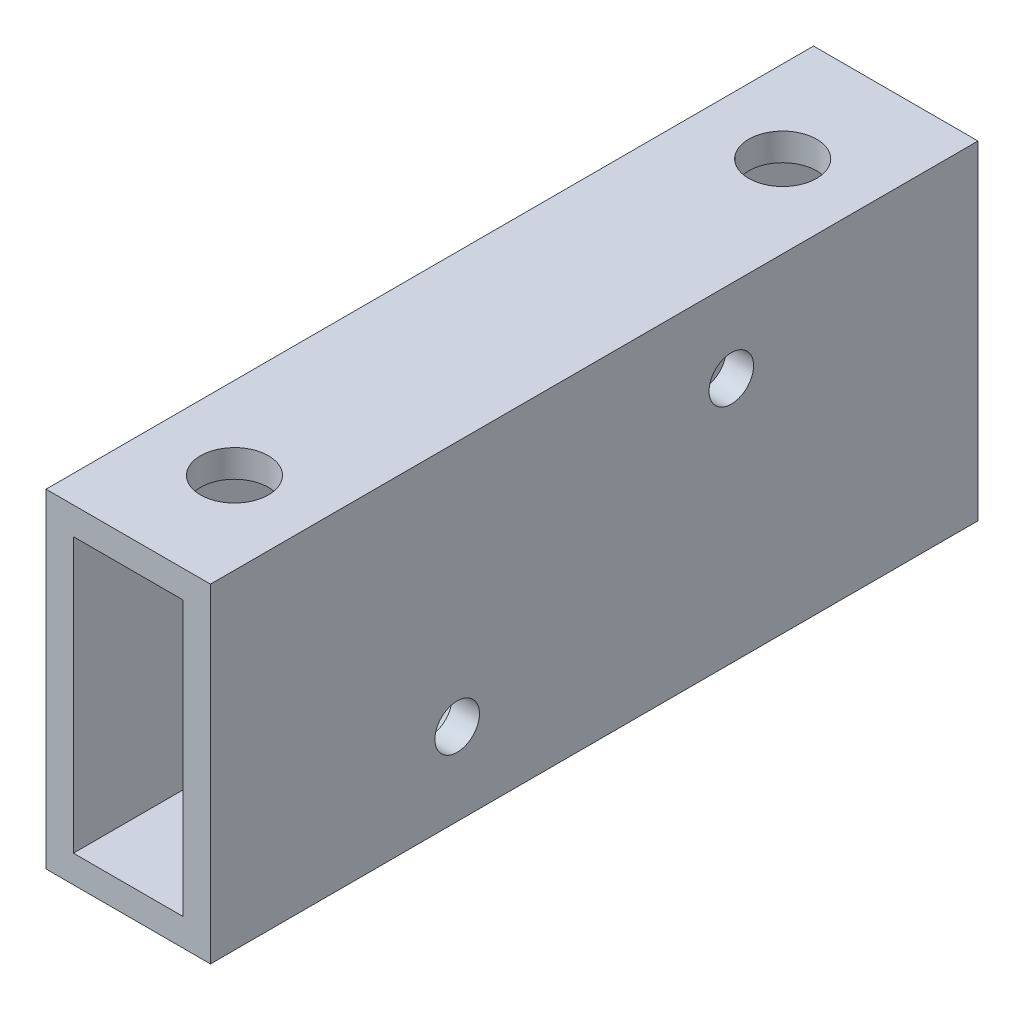
ISO-10303-21;
HEADER;
FILE_DESCRIPTION(('STEP AP214'),'2;1');
FILE_NAME('part.step','',(''),(''),'','','');
FILE_SCHEMA(('AUTOMOTIVE_DESIGN { 1 0 10303 214 1 1 1 1 }'));
ENDSEC;
DATA;
#1=APPLICATION_CONTEXT('core data for automotive mechanical design processes');
#2=APPLICATION_PROTOCOL_DEFINITION('international standard','automotive_design',2000,#1);
#3=PRODUCT_CONTEXT('',#1,'mechanical');
#4=PRODUCT('Part','Part','',(#3));
#5=PRODUCT_RELATED_PRODUCT_CATEGORY('part','',(#4));
#6=PRODUCT_DEFINITION_FORMATION('','',#4);
#7=PRODUCT_DEFINITION_CONTEXT('part definition',#1,'design');
#8=PRODUCT_DEFINITION('design','',#6,#7);
#9=PRODUCT_DEFINITION_SHAPE('','',#8);
#10=(LENGTH_UNIT() NAMED_UNIT(*) SI_UNIT(.MILLI.,.METRE.));
#11=(NAMED_UNIT(*) PLANE_ANGLE_UNIT() SI_UNIT($,.RADIAN.));
#12=(NAMED_UNIT(*) SI_UNIT($,.STERADIAN.) SOLID_ANGLE_UNIT());
#13=UNCERTAINTY_MEASURE_WITH_UNIT(LENGTH_MEASURE(1.E-05),#10,'distance_accuracy_value','');
#14=(GEOMETRIC_REPRESENTATION_CONTEXT(3) GLOBAL_UNCERTAINTY_ASSIGNED_CONTEXT((#13)) GLOBAL_UNIT_ASSIGNED_CONTEXT((#10,
#11,#12)) REPRESENTATION_CONTEXT('',''));
#15=CARTESIAN_POINT('',(0.,0.,0.));
#16=DIRECTION('',(0.,0.,1.));
#17=DIRECTION('',(1.,0.,0.));
#18=AXIS2_PLACEMENT_3D('',#15,#16,#17);
#19=CARTESIAN_POINT('',(0.,0.,88.9));
#20=DIRECTION('',(0.,0.,-1.));
#21=DIRECTION('',(-1.,0.,0.));
#22=AXIS2_PLACEMENT_3D('',#19,#20,#21);
#23=PLANE('',#22);
#24=DIRECTION('',(0.,1.,0.));
#25=VECTOR('',#24,1.);
#26=CARTESIAN_POINT('',(9.525,-19.05,88.9));
#27=LINE('',#26,#25);
#28=CARTESIAN_POINT('',(9.525,-19.05,88.9));
#29=VERTEX_POINT('',#28);
#30=CARTESIAN_POINT('',(9.525,19.05,88.9));
#31=VERTEX_POINT('',#30);
#32=EDGE_CURVE('E135',#29,#31,#27,.T.);
#33=ORIENTED_EDGE('',*,*,#32,.T.);
#34=DIRECTION('',(-1.,0.,0.));
#35=VECTOR('',#34,1.);
#36=CARTESIAN_POINT('',(-9.525,19.05,88.9));
#37=LINE('',#36,#35);
#38=CARTESIAN_POINT('',(-9.525,19.05,88.9));
#39=VERTEX_POINT('',#38);
#40=EDGE_CURVE('E138',#31,#39,#37,.T.);
#41=ORIENTED_EDGE('',*,*,#40,.T.);
#42=DIRECTION('',(0.,-1.,0.));
#43=VECTOR('',#42,1.);
#44=CARTESIAN_POINT('',(-9.525,-19.05,88.9));
#45=LINE('',#44,#43);
#46=CARTESIAN_POINT('',(-9.525,-19.05,88.9));
#47=VERTEX_POINT('',#46);
#48=EDGE_CURVE('E141',#39,#47,#45,.T.);
#49=ORIENTED_EDGE('',*,*,#48,.T.);
#50=DIRECTION('',(1.,0.,0.));
#51=VECTOR('',#50,1.);
#52=CARTESIAN_POINT('',(-9.525,-19.05,88.9));
#53=LINE('',#52,#51);
#54=EDGE_CURVE('E143',#47,#29,#53,.T.);
#55=ORIENTED_EDGE('',*,*,#54,.T.);
#56=EDGE_LOOP('',(#33,#41,#49,#55));
#57=FACE_BOUND('',#56,.T.);
#58=DIRECTION('',(1.,0.,0.));
#59=VECTOR('',#58,1.);
#60=CARTESIAN_POINT('',(-6.35,-15.875,88.9));
#61=LINE('',#60,#59);
#62=CARTESIAN_POINT('',(-6.35,-15.875,88.9));
#63=VERTEX_POINT('',#62);
#64=CARTESIAN_POINT('',(6.35,-15.875,88.9));
#65=VERTEX_POINT('',#64);
#66=EDGE_CURVE('E97',#63,#65,#61,.T.);
#67=ORIENTED_EDGE('',*,*,#66,.F.);
#68=DIRECTION('',(0.,-1.,0.));
#69=VECTOR('',#68,1.);
#70=CARTESIAN_POINT('',(-6.35,-15.875,88.9));
#71=LINE('',#70,#69);
#72=CARTESIAN_POINT('',(-6.35,15.875,88.9));
#73=VERTEX_POINT('',#72);
#74=EDGE_CURVE('E119',#73,#63,#71,.T.);
#75=ORIENTED_EDGE('',*,*,#74,.F.);
#76=DIRECTION('',(-1.,0.,0.));
#77=VECTOR('',#76,1.);
#78=CARTESIAN_POINT('',(-6.35,15.875,88.9));
#79=LINE('',#78,#77);
#80=CARTESIAN_POINT('',(6.35,15.875,88.9));
#81=VERTEX_POINT('',#80);
#82=EDGE_CURVE('E117',#81,#73,#79,.T.);
#83=ORIENTED_EDGE('',*,*,#82,.F.);
#84=DIRECTION('',(0.,1.,0.));
#85=VECTOR('',#84,1.);
#86=CARTESIAN_POINT('',(6.35,-15.875,88.9));
#87=LINE('',#86,#85);
#88=EDGE_CURVE('E105',#65,#81,#87,.T.);
#89=ORIENTED_EDGE('',*,*,#88,.F.);
#90=EDGE_LOOP('',(#67,#75,#83,#89));
#91=FACE_BOUND('',#90,.T.);
#92=ADVANCED_FACE('F32',(#57,#91),#23,.F.);
#93=CARTESIAN_POINT('',(0.,0.,0.));
#94=DIRECTION('',(0.,0.,-1.));
#95=DIRECTION('',(-1.,0.,0.));
#96=AXIS2_PLACEMENT_3D('',#93,#94,#95);
#97=PLANE('',#96);
#98=DIRECTION('',(0.,1.,0.));
#99=VECTOR('',#98,1.);
#100=CARTESIAN_POINT('',(9.525,-19.05,0.));
#101=LINE('',#100,#99);
#102=CARTESIAN_POINT('',(9.525,-19.05,0.));
#103=VERTEX_POINT('',#102);
#104=CARTESIAN_POINT('',(9.525,19.05,0.));
#105=VERTEX_POINT('',#104);
#106=EDGE_CURVE('E113',#103,#105,#101,.T.);
#107=ORIENTED_EDGE('',*,*,#106,.F.);
#108=DIRECTION('',(1.,0.,0.));
#109=VECTOR('',#108,1.);
#110=CARTESIAN_POINT('',(-9.525,-19.05,0.));
#111=LINE('',#110,#109);
#112=CARTESIAN_POINT('',(-9.525,-19.05,0.));
#113=VERTEX_POINT('',#112);
#114=EDGE_CURVE('E139',#113,#103,#111,.T.);
#115=ORIENTED_EDGE('',*,*,#114,.F.);
#116=DIRECTION('',(0.,-1.,0.));
#117=VECTOR('',#116,1.);
#118=CARTESIAN_POINT('',(-9.525,-19.05,0.));
#119=LINE('',#118,#117);
#120=CARTESIAN_POINT('',(-9.525,19.05,0.));
#121=VERTEX_POINT('',#120);
#122=EDGE_CURVE('E150',#121,#113,#119,.T.);
#123=ORIENTED_EDGE('',*,*,#122,.F.);
#124=DIRECTION('',(-1.,0.,0.));
#125=VECTOR('',#124,1.);
#126=CARTESIAN_POINT('',(-9.525,19.05,0.));
#127=LINE('',#126,#125);
#128=EDGE_CURVE('E148',#105,#121,#127,.T.);
#129=ORIENTED_EDGE('',*,*,#128,.F.);
#130=EDGE_LOOP('',(#107,#115,#123,#129));
#131=FACE_BOUND('',#130,.T.);
#132=DIRECTION('',(0.,-1.,0.));
#133=VECTOR('',#132,1.);
#134=CARTESIAN_POINT('',(-6.35,-15.875,0.));
#135=LINE('',#134,#133);
#136=CARTESIAN_POINT('',(-6.35,15.875,0.));
#137=VERTEX_POINT('',#136);
#138=CARTESIAN_POINT('',(-6.35,-15.875,0.));
#139=VERTEX_POINT('',#138);
#140=EDGE_CURVE('E106',#137,#139,#135,.T.);
#141=ORIENTED_EDGE('',*,*,#140,.T.);
#142=DIRECTION('',(1.,0.,0.));
#143=VECTOR('',#142,1.);
#144=CARTESIAN_POINT('',(-6.35,-15.875,0.));
#145=LINE('',#144,#143);
#146=CARTESIAN_POINT('',(6.35,-15.875,0.));
#147=VERTEX_POINT('',#146);
#148=EDGE_CURVE('E55',#139,#147,#145,.T.);
#149=ORIENTED_EDGE('',*,*,#148,.T.);
#150=DIRECTION('',(0.,1.,0.));
#151=VECTOR('',#150,1.);
#152=CARTESIAN_POINT('',(6.35,-15.875,0.));
#153=LINE('',#152,#151);
#154=CARTESIAN_POINT('',(6.35,15.875,0.));
#155=VERTEX_POINT('',#154);
#156=EDGE_CURVE('E112',#147,#155,#153,.T.);
#157=ORIENTED_EDGE('',*,*,#156,.T.);
#158=DIRECTION('',(-1.,0.,0.));
#159=VECTOR('',#158,1.);
#160=CARTESIAN_POINT('',(-6.35,15.875,0.));
#161=LINE('',#160,#159);
#162=EDGE_CURVE('E127',#155,#137,#161,.T.);
#163=ORIENTED_EDGE('',*,*,#162,.T.);
#164=EDGE_LOOP('',(#141,#149,#157,#163));
#165=FACE_BOUND('',#164,.T.);
#166=ADVANCED_FACE('F168',(#131,#165),#97,.T.);
#167=CARTESIAN_POINT('',(9.525,-19.05,88.9));
#168=DIRECTION('',(-1.,0.,0.));
#169=DIRECTION('',(0.,0.,1.));
#170=AXIS2_PLACEMENT_3D('',#167,#168,#169);
#171=PLANE('',#170);
#172=CARTESIAN_POINT('',(9.525,9.52500000004705,28.574999999997));
#173=DIRECTION('',(1.,0.,0.));
#174=DIRECTION('',(0.,0.,-1.));
#175=AXIS2_PLACEMENT_3D('',#172,#173,#174);
#176=CIRCLE('',#175,2.57968750000001);
#177=CARTESIAN_POINT('',(9.525,9.52500000004705,25.995312499997));
#178=VERTEX_POINT('',#177);
#179=EDGE_CURVE('E237',#178,#178,#176,.T.);
#180=ORIENTED_EDGE('',*,*,#179,.F.);
#181=EDGE_LOOP('',(#180));
#182=FACE_BOUND('',#181,.T.);
#183=CARTESIAN_POINT('',(9.525,-9.52499999995285,60.3249999999971));
#184=DIRECTION('',(1.,0.,0.));
#185=DIRECTION('',(0.,0.,-1.));
#186=AXIS2_PLACEMENT_3D('',#183,#184,#185);
#187=CIRCLE('',#186,2.57968750000001);
#188=CARTESIAN_POINT('',(9.525,-9.52499999995285,57.7453124999971));
#189=VERTEX_POINT('',#188);
#190=EDGE_CURVE('E229',#189,#189,#187,.T.);
#191=ORIENTED_EDGE('',*,*,#190,.F.);
#192=EDGE_LOOP('',(#191));
#193=FACE_BOUND('',#192,.T.);
#194=ORIENTED_EDGE('',*,*,#106,.T.);
#195=DIRECTION('',(0.,0.,-1.));
#196=VECTOR('',#195,1.);
#197=CARTESIAN_POINT('',(9.525,19.05,88.9));
#198=LINE('',#197,#196);
#199=EDGE_CURVE('E11',#31,#105,#198,.T.);
#200=ORIENTED_EDGE('',*,*,#199,.F.);
#201=ORIENTED_EDGE('',*,*,#32,.F.);
#202=DIRECTION('',(0.,0.,-1.));
#203=VECTOR('',#202,1.);
#204=CARTESIAN_POINT('',(9.525,-19.05,88.9));
#205=LINE('',#204,#203);
#206=EDGE_CURVE('E145',#29,#103,#205,.T.);
#207=ORIENTED_EDGE('',*,*,#206,.T.);
#208=EDGE_LOOP('',(#194,#200,#201,#207));
#209=FACE_BOUND('',#208,.T.);
#210=ADVANCED_FACE('F34',(#182,#193,#209),#171,.F.);
#211=CARTESIAN_POINT('',(-9.525,19.05,88.9));
#212=DIRECTION('',(0.,-1.,0.));
#213=DIRECTION('',(0.,0.,-1.));
#214=AXIS2_PLACEMENT_3D('',#211,#212,#213);
#215=PLANE('',#214);
#216=CARTESIAN_POINT('',(0.,19.05,13.096875));
#217=DIRECTION('',(0.,1.,0.));
#218=DIRECTION('',(0.,0.,1.));
#219=AXIS2_PLACEMENT_3D('',#216,#217,#218);
#220=CIRCLE('',#219,3.937);
#221=CARTESIAN_POINT('',(0.,19.05,17.033875));
#222=VERTEX_POINT('',#221);
#223=EDGE_CURVE('E223',#222,#222,#220,.T.);
#224=ORIENTED_EDGE('',*,*,#223,.F.);
#225=EDGE_LOOP('',(#224));
#226=FACE_BOUND('',#225,.T.);
#227=CARTESIAN_POINT('',(0.,19.05,76.596875));
#228=DIRECTION('',(0.,1.,0.));
#229=DIRECTION('',(0.,0.,1.));
#230=AXIS2_PLACEMENT_3D('',#227,#228,#229);
#231=CIRCLE('',#230,3.937);
#232=CARTESIAN_POINT('',(0.,19.05,80.533875));
#233=VERTEX_POINT('',#232);
#234=EDGE_CURVE('E219',#233,#233,#231,.T.);
#235=ORIENTED_EDGE('',*,*,#234,.F.);
#236=EDGE_LOOP('',(#235));
#237=FACE_BOUND('',#236,.T.);
#238=ORIENTED_EDGE('',*,*,#128,.T.);
#239=DIRECTION('',(0.,0.,-1.));
#240=VECTOR('',#239,1.);
#241=CARTESIAN_POINT('',(-9.525,19.05,88.9));
#242=LINE('',#241,#240);
#243=EDGE_CURVE('E40',#39,#121,#242,.T.);
#244=ORIENTED_EDGE('',*,*,#243,.F.);
#245=ORIENTED_EDGE('',*,*,#40,.F.);
#246=ORIENTED_EDGE('',*,*,#199,.T.);
#247=EDGE_LOOP('',(#238,#244,#245,#246));
#248=FACE_BOUND('',#247,.T.);
#249=ADVANCED_FACE('F178',(#226,#237,#248),#215,.F.);
#250=CARTESIAN_POINT('',(-9.525,-19.05,88.9));
#251=DIRECTION('',(1.,0.,0.));
#252=DIRECTION('',(0.,0.,-1.));
#253=AXIS2_PLACEMENT_3D('',#250,#251,#252);
#254=PLANE('',#253);
#255=ORIENTED_EDGE('',*,*,#122,.T.);
#256=DIRECTION('',(0.,0.,-1.));
#257=VECTOR('',#256,1.);
#258=CARTESIAN_POINT('',(-9.525,-19.05,88.9));
#259=LINE('',#258,#257);
#260=EDGE_CURVE('E155',#47,#113,#259,.T.);
#261=ORIENTED_EDGE('',*,*,#260,.F.);
#262=ORIENTED_EDGE('',*,*,#48,.F.);
#263=ORIENTED_EDGE('',*,*,#243,.T.);
#264=EDGE_LOOP('',(#255,#261,#262,#263));
#265=FACE_BOUND('',#264,.T.);
#266=ADVANCED_FACE('F162',(#265),#254,.F.);
#267=CARTESIAN_POINT('',(-9.525,-19.05,88.9));
#268=DIRECTION('',(0.,1.,0.));
#269=DIRECTION('',(0.,0.,1.));
#270=AXIS2_PLACEMENT_3D('',#267,#268,#269);
#271=PLANE('',#270);
#272=CARTESIAN_POINT('',(0.,-19.05,13.096875));
#273=DIRECTION('',(0.,1.,0.));
#274=DIRECTION('',(0.,0.,1.));
#275=AXIS2_PLACEMENT_3D('',#272,#273,#274);
#276=CIRCLE('',#275,2.778125);
#277=CARTESIAN_POINT('',(0.,-19.05,15.875));
#278=VERTEX_POINT('',#277);
#279=EDGE_CURVE('E207',#278,#278,#276,.T.);
#280=ORIENTED_EDGE('',*,*,#279,.T.);
#281=EDGE_LOOP('',(#280));
#282=FACE_BOUND('',#281,.T.);
#283=CARTESIAN_POINT('',(0.,-19.05,76.596875));
#284=DIRECTION('',(0.,1.,0.));
#285=DIRECTION('',(0.,0.,1.));
#286=AXIS2_PLACEMENT_3D('',#283,#284,#285);
#287=CIRCLE('',#286,2.778125);
#288=CARTESIAN_POINT('',(0.,-19.05,79.375));
#289=VERTEX_POINT('',#288);
#290=EDGE_CURVE('E210',#289,#289,#287,.T.);
#291=ORIENTED_EDGE('',*,*,#290,.T.);
#292=EDGE_LOOP('',(#291));
#293=FACE_BOUND('',#292,.T.);
#294=ORIENTED_EDGE('',*,*,#114,.T.);
#295=ORIENTED_EDGE('',*,*,#206,.F.);
#296=ORIENTED_EDGE('',*,*,#54,.F.);
#297=ORIENTED_EDGE('',*,*,#260,.T.);
#298=EDGE_LOOP('',(#294,#295,#296,#297));
#299=FACE_BOUND('',#298,.T.);
#300=ADVANCED_FACE('F172',(#282,#293,#299),#271,.F.);
#301=CARTESIAN_POINT('',(-6.35,-15.875,88.9));
#302=DIRECTION('',(0.,1.,0.));
#303=DIRECTION('',(0.,0.,1.));
#304=AXIS2_PLACEMENT_3D('',#301,#302,#303);
#305=PLANE('',#304);
#306=CARTESIAN_POINT('',(0.,-15.875,13.096875));
#307=DIRECTION('',(0.,1.,0.));
#308=DIRECTION('',(0.,0.,1.));
#309=AXIS2_PLACEMENT_3D('',#306,#307,#308);
#310=CIRCLE('',#309,2.778125);
#311=CARTESIAN_POINT('',(0.,-15.875,15.875));
#312=VERTEX_POINT('',#311);
#313=EDGE_CURVE('E212',#312,#312,#310,.T.);
#314=ORIENTED_EDGE('',*,*,#313,.F.);
#315=EDGE_LOOP('',(#314));
#316=FACE_BOUND('',#315,.T.);
#317=CARTESIAN_POINT('',(0.,-15.875,76.596875));
#318=DIRECTION('',(0.,1.,0.));
#319=DIRECTION('',(0.,0.,1.));
#320=AXIS2_PLACEMENT_3D('',#317,#318,#319);
#321=CIRCLE('',#320,2.778125);
#322=CARTESIAN_POINT('',(0.,-15.875,79.375));
#323=VERTEX_POINT('',#322);
#324=EDGE_CURVE('E125',#323,#323,#321,.T.);
#325=ORIENTED_EDGE('',*,*,#324,.F.);
#326=EDGE_LOOP('',(#325));
#327=FACE_BOUND('',#326,.T.);
#328=ORIENTED_EDGE('',*,*,#148,.F.);
#329=DIRECTION('',(0.,0.,-1.));
#330=VECTOR('',#329,1.);
#331=CARTESIAN_POINT('',(-6.35,-15.875,88.9));
#332=LINE('',#331,#330);
#333=EDGE_CURVE('E101',#63,#139,#332,.T.);
#334=ORIENTED_EDGE('',*,*,#333,.F.);
#335=ORIENTED_EDGE('',*,*,#66,.T.);
#336=DIRECTION('',(0.,0.,-1.));
#337=VECTOR('',#336,1.);
#338=CARTESIAN_POINT('',(6.35,-15.875,88.9));
#339=LINE('',#338,#337);
#340=EDGE_CURVE('E100',#65,#147,#339,.T.);
#341=ORIENTED_EDGE('',*,*,#340,.T.);
#342=EDGE_LOOP('',(#328,#334,#335,#341));
#343=FACE_BOUND('',#342,.T.);
#344=ADVANCED_FACE('F99',(#316,#327,#343),#305,.T.);
#345=CARTESIAN_POINT('',(6.35,-15.875,88.9));
#346=DIRECTION('',(-1.,0.,0.));
#347=DIRECTION('',(0.,-1.,0.));
#348=AXIS2_PLACEMENT_3D('',#345,#346,#347);
#349=PLANE('',#348);
#350=CARTESIAN_POINT('',(6.35,9.52500000004705,28.574999999997));
#351=DIRECTION('',(-1.,0.,0.));
#352=DIRECTION('',(0.,-1.,0.));
#353=AXIS2_PLACEMENT_3D('',#350,#351,#352);
#354=CIRCLE('',#353,2.57968750000001);
#355=CARTESIAN_POINT('',(6.35,6.94531250004704,28.574999999997));
#356=VERTEX_POINT('',#355);
#357=EDGE_CURVE('E240',#356,#356,#354,.F.);
#358=ORIENTED_EDGE('',*,*,#357,.T.);
#359=EDGE_LOOP('',(#358));
#360=FACE_BOUND('',#359,.T.);
#361=CARTESIAN_POINT('',(6.35,-9.52499999995285,60.3249999999971));
#362=DIRECTION('',(-1.,0.,0.));
#363=DIRECTION('',(0.,-1.,0.));
#364=AXIS2_PLACEMENT_3D('',#361,#362,#363);
#365=CIRCLE('',#364,2.57968750000001);
#366=CARTESIAN_POINT('',(6.35,-12.1046874999529,60.3249999999971));
#367=VERTEX_POINT('',#366);
#368=EDGE_CURVE('E234',#367,#367,#365,.F.);
#369=ORIENTED_EDGE('',*,*,#368,.T.);
#370=EDGE_LOOP('',(#369));
#371=FACE_BOUND('',#370,.T.);
#372=ORIENTED_EDGE('',*,*,#156,.F.);
#373=ORIENTED_EDGE('',*,*,#340,.F.);
#374=ORIENTED_EDGE('',*,*,#88,.T.);
#375=DIRECTION('',(0.,0.,-1.));
#376=VECTOR('',#375,1.);
#377=CARTESIAN_POINT('',(6.35,15.875,88.9));
#378=LINE('',#377,#376);
#379=EDGE_CURVE('E114',#81,#155,#378,.T.);
#380=ORIENTED_EDGE('',*,*,#379,.T.);
#381=EDGE_LOOP('',(#372,#373,#374,#380));
#382=FACE_BOUND('',#381,.T.);
#383=ADVANCED_FACE('F109',(#360,#371,#382),#349,.T.);
#384=CARTESIAN_POINT('',(-6.35,15.875,88.9));
#385=DIRECTION('',(0.,-1.,0.));
#386=DIRECTION('',(1.,0.,0.));
#387=AXIS2_PLACEMENT_3D('',#384,#385,#386);
#388=PLANE('',#387);
#389=CARTESIAN_POINT('',(0.,15.875,13.096875));
#390=DIRECTION('',(0.,-1.,0.));
#391=DIRECTION('',(1.,0.,0.));
#392=AXIS2_PLACEMENT_3D('',#389,#390,#391);
#393=CIRCLE('',#392,3.937);
#394=CARTESIAN_POINT('',(3.937,15.875,13.096875));
#395=VERTEX_POINT('',#394);
#396=EDGE_CURVE('E226',#395,#395,#393,.F.);
#397=ORIENTED_EDGE('',*,*,#396,.T.);
#398=EDGE_LOOP('',(#397));
#399=FACE_BOUND('',#398,.T.);
#400=CARTESIAN_POINT('',(0.,15.875,76.596875));
#401=DIRECTION('',(0.,-1.,0.));
#402=DIRECTION('',(1.,0.,0.));
#403=AXIS2_PLACEMENT_3D('',#400,#401,#402);
#404=CIRCLE('',#403,3.937);
#405=CARTESIAN_POINT('',(3.937,15.875,76.596875));
#406=VERTEX_POINT('',#405);
#407=EDGE_CURVE('E220',#406,#406,#404,.F.);
#408=ORIENTED_EDGE('',*,*,#407,.T.);
#409=EDGE_LOOP('',(#408));
#410=FACE_BOUND('',#409,.T.);
#411=ORIENTED_EDGE('',*,*,#162,.F.);
#412=ORIENTED_EDGE('',*,*,#379,.F.);
#413=ORIENTED_EDGE('',*,*,#82,.T.);
#414=DIRECTION('',(0.,0.,-1.));
#415=VECTOR('',#414,1.);
#416=CARTESIAN_POINT('',(-6.35,15.875,88.9));
#417=LINE('',#416,#415);
#418=EDGE_CURVE('E47',#73,#137,#417,.T.);
#419=ORIENTED_EDGE('',*,*,#418,.T.);
#420=EDGE_LOOP('',(#411,#412,#413,#419));
#421=FACE_BOUND('',#420,.T.);
#422=ADVANCED_FACE('F281',(#399,#410,#421),#388,.T.);
#423=CARTESIAN_POINT('',(-6.35,-15.875,88.9));
#424=DIRECTION('',(1.,0.,0.));
#425=DIRECTION('',(0.,0.,-1.));
#426=AXIS2_PLACEMENT_3D('',#423,#424,#425);
#427=PLANE('',#426);
#428=ORIENTED_EDGE('',*,*,#140,.F.);
#429=ORIENTED_EDGE('',*,*,#418,.F.);
#430=ORIENTED_EDGE('',*,*,#74,.T.);
#431=ORIENTED_EDGE('',*,*,#333,.T.);
#432=EDGE_LOOP('',(#428,#429,#430,#431));
#433=FACE_BOUND('',#432,.T.);
#434=ADVANCED_FACE('F277',(#433),#427,.T.);
#435=CARTESIAN_POINT('',(0.,-19.05,76.596875));
#436=DIRECTION('',(0.,1.,0.));
#437=DIRECTION('',(0.,0.,1.));
#438=AXIS2_PLACEMENT_3D('',#435,#436,#437);
#439=CYLINDRICAL_SURFACE('',#438,2.778125);
#440=CARTESIAN_POINT('',(0.,-15.875,79.375));
#441=CARTESIAN_POINT('',(0.,-15.9080729166667,79.375));
#442=CARTESIAN_POINT('',(0.,-15.9411458333333,79.375));
#443=CARTESIAN_POINT('',(0.,-16.0072916666667,79.375));
#444=CARTESIAN_POINT('',(0.,-16.0403645833333,79.375));
#445=CARTESIAN_POINT('',(0.,-16.1065104166667,79.375));
#446=CARTESIAN_POINT('',(0.,-16.1395833333333,79.375));
#447=CARTESIAN_POINT('',(0.,-16.2057291666667,79.375));
#448=CARTESIAN_POINT('',(0.,-16.2388020833333,79.375));
#449=CARTESIAN_POINT('',(0.,-16.3049479166667,79.375));
#450=CARTESIAN_POINT('',(0.,-16.3380208333333,79.375));
#451=CARTESIAN_POINT('',(0.,-16.4041666666667,79.375));
#452=CARTESIAN_POINT('',(0.,-16.4372395833333,79.375));
#453=CARTESIAN_POINT('',(0.,-16.5033854166667,79.375));
#454=CARTESIAN_POINT('',(0.,-16.5364583333333,79.375));
#455=CARTESIAN_POINT('',(0.,-16.6026041666667,79.375));
#456=CARTESIAN_POINT('',(0.,-16.6356770833333,79.375));
#457=CARTESIAN_POINT('',(0.,-16.7018229166667,79.375));
#458=CARTESIAN_POINT('',(0.,-16.7348958333333,79.375));
#459=CARTESIAN_POINT('',(0.,-16.8010416666667,79.375));
#460=CARTESIAN_POINT('',(0.,-16.8341145833333,79.375));
#461=CARTESIAN_POINT('',(0.,-16.9002604166667,79.375));
#462=CARTESIAN_POINT('',(0.,-16.9333333333333,79.375));
#463=CARTESIAN_POINT('',(0.,-16.9994791666667,79.375));
#464=CARTESIAN_POINT('',(0.,-17.0325520833333,79.375));
#465=CARTESIAN_POINT('',(0.,-17.0986979166667,79.375));
#466=CARTESIAN_POINT('',(0.,-17.1317708333333,79.375));
#467=CARTESIAN_POINT('',(0.,-17.1979166666667,79.375));
#468=CARTESIAN_POINT('',(0.,-17.2309895833333,79.375));
#469=CARTESIAN_POINT('',(0.,-17.2971354166667,79.375));
#470=CARTESIAN_POINT('',(0.,-17.3302083333333,79.375));
#471=CARTESIAN_POINT('',(0.,-17.3963541666667,79.375));
#472=CARTESIAN_POINT('',(0.,-17.4294270833333,79.375));
#473=CARTESIAN_POINT('',(0.,-17.4955729166667,79.375));
#474=CARTESIAN_POINT('',(0.,-17.5286458333333,79.375));
#475=CARTESIAN_POINT('',(0.,-17.5947916666667,79.375));
#476=CARTESIAN_POINT('',(0.,-17.6278645833333,79.375));
#477=CARTESIAN_POINT('',(0.,-17.6940104166667,79.375));
#478=CARTESIAN_POINT('',(0.,-17.7270833333333,79.375));
#479=CARTESIAN_POINT('',(0.,-17.7932291666667,79.375));
#480=CARTESIAN_POINT('',(0.,-17.8263020833333,79.375));
#481=CARTESIAN_POINT('',(0.,-17.8924479166667,79.375));
#482=CARTESIAN_POINT('',(0.,-17.9255208333333,79.375));
#483=CARTESIAN_POINT('',(0.,-17.9916666666667,79.375));
#484=CARTESIAN_POINT('',(0.,-18.0247395833333,79.375));
#485=CARTESIAN_POINT('',(0.,-18.0908854166667,79.375));
#486=CARTESIAN_POINT('',(0.,-18.1239583333333,79.375));
#487=CARTESIAN_POINT('',(0.,-18.1901041666667,79.375));
#488=CARTESIAN_POINT('',(0.,-18.2231770833333,79.375));
#489=CARTESIAN_POINT('',(0.,-18.2893229166667,79.375));
#490=CARTESIAN_POINT('',(0.,-18.3223958333333,79.375));
#491=CARTESIAN_POINT('',(0.,-18.3885416666667,79.375));
#492=CARTESIAN_POINT('',(0.,-18.4216145833333,79.375));
#493=CARTESIAN_POINT('',(0.,-18.4877604166667,79.375));
#494=CARTESIAN_POINT('',(0.,-18.5208333333333,79.375));
#495=CARTESIAN_POINT('',(0.,-18.5869791666667,79.375));
#496=CARTESIAN_POINT('',(0.,-18.6200520833333,79.375));
#497=CARTESIAN_POINT('',(0.,-18.6861979166667,79.375));
#498=CARTESIAN_POINT('',(0.,-18.7192708333333,79.375));
#499=CARTESIAN_POINT('',(0.,-18.7854166666667,79.375));
#500=CARTESIAN_POINT('',(0.,-18.8184895833333,79.375));
#501=CARTESIAN_POINT('',(0.,-18.8846354166667,79.375));
#502=CARTESIAN_POINT('',(0.,-18.9177083333333,79.375));
#503=CARTESIAN_POINT('',(0.,-18.9838541666667,79.375));
#504=CARTESIAN_POINT('',(0.,-19.0169270833333,79.375));
#505=CARTESIAN_POINT('',(0.,-19.05,79.375));
#506=B_SPLINE_CURVE_WITH_KNOTS('',3,(#440,#441,#442,#443,#444,#445,#446,#447,#448,#449,#450,
#451,#452,#453,#454,#455,#456,#457,#458,#459,#460,#461,#462,#463,#464,#465,#466,#467,#468,#469,
#470,#471,#472,#473,#474,#475,#476,#477,#478,#479,#480,#481,#482,#483,#484,#485,#486,#487,#488,
#489,#490,#491,#492,#493,#494,#495,#496,#497,#498,#499,#500,#501,#502,#503,#504,#505),
.UNSPECIFIED.,.F.,.F.,(4,2,2,2,2,2,2,2,2,2,2,2,2,2,2,2,2,2,2,2,2,2,2,2,2,2,2,2,2,2,2,2,4),(0.,
0.0992187499999977,0.198437499999999,0.29765625,0.396874999999998,0.496093749999999,0.5953125,
0.694531249999998,0.793749999999999,0.892968749999997,0.992187499999998,1.09140625,1.190625,
1.28984375,1.3890625,1.48828125,1.5875,1.68671875,1.7859375,1.88515625,1.984375,2.08359375,
2.1828125,2.28203125,2.38125,2.48046875,2.5796875,2.67890625,2.778125,2.87734375,2.9765625,
3.07578125,3.175),.UNSPECIFIED.);
#507=EDGE_CURVE('BSEAM273',#323,#289,#506,.T.);
#508=ORIENTED_EDGE('',*,*,#324,.T.);
#509=ORIENTED_EDGE('',*,*,#290,.F.);
#510=ORIENTED_EDGE('',*,*,#507,.T.);
#511=ORIENTED_EDGE('',*,*,#507,.F.);
#512=EDGE_LOOP('',(#508,#510,#509,#511));
#513=FACE_BOUND('',#512,.T.);
#514=ADVANCED_FACE('F273',(#513),#439,.F.);
#515=CARTESIAN_POINT('',(0.,-19.05,13.096875));
#516=DIRECTION('',(0.,1.,0.));
#517=DIRECTION('',(0.,0.,1.));
#518=AXIS2_PLACEMENT_3D('',#515,#516,#517);
#519=CYLINDRICAL_SURFACE('',#518,2.778125);
#520=CARTESIAN_POINT('',(0.,-15.875,15.875));
#521=CARTESIAN_POINT('',(0.,-15.9080729166667,15.875));
#522=CARTESIAN_POINT('',(0.,-15.9411458333333,15.875));
#523=CARTESIAN_POINT('',(0.,-16.0072916666667,15.875));
#524=CARTESIAN_POINT('',(0.,-16.0403645833333,15.875));
#525=CARTESIAN_POINT('',(0.,-16.1065104166667,15.875));
#526=CARTESIAN_POINT('',(0.,-16.1395833333333,15.875));
#527=CARTESIAN_POINT('',(0.,-16.2057291666667,15.875));
#528=CARTESIAN_POINT('',(0.,-16.2388020833333,15.875));
#529=CARTESIAN_POINT('',(0.,-16.3049479166667,15.875));
#530=CARTESIAN_POINT('',(0.,-16.3380208333333,15.875));
#531=CARTESIAN_POINT('',(0.,-16.4041666666667,15.875));
#532=CARTESIAN_POINT('',(0.,-16.4372395833333,15.875));
#533=CARTESIAN_POINT('',(0.,-16.5033854166667,15.875));
#534=CARTESIAN_POINT('',(0.,-16.5364583333333,15.875));
#535=CARTESIAN_POINT('',(0.,-16.6026041666667,15.875));
#536=CARTESIAN_POINT('',(0.,-16.6356770833333,15.875));
#537=CARTESIAN_POINT('',(0.,-16.7018229166667,15.875));
#538=CARTESIAN_POINT('',(0.,-16.7348958333333,15.875));
#539=CARTESIAN_POINT('',(0.,-16.8010416666667,15.875));
#540=CARTESIAN_POINT('',(0.,-16.8341145833333,15.875));
#541=CARTESIAN_POINT('',(0.,-16.9002604166667,15.875));
#542=CARTESIAN_POINT('',(0.,-16.9333333333333,15.875));
#543=CARTESIAN_POINT('',(0.,-16.9994791666667,15.875));
#544=CARTESIAN_POINT('',(0.,-17.0325520833333,15.875));
#545=CARTESIAN_POINT('',(0.,-17.0986979166667,15.875));
#546=CARTESIAN_POINT('',(0.,-17.1317708333333,15.875));
#547=CARTESIAN_POINT('',(0.,-17.1979166666667,15.875));
#548=CARTESIAN_POINT('',(0.,-17.2309895833333,15.875));
#549=CARTESIAN_POINT('',(0.,-17.2971354166667,15.875));
#550=CARTESIAN_POINT('',(0.,-17.3302083333333,15.875));
#551=CARTESIAN_POINT('',(0.,-17.3963541666667,15.875));
#552=CARTESIAN_POINT('',(0.,-17.4294270833333,15.875));
#553=CARTESIAN_POINT('',(0.,-17.4955729166667,15.875));
#554=CARTESIAN_POINT('',(0.,-17.5286458333333,15.875));
#555=CARTESIAN_POINT('',(0.,-17.5947916666667,15.875));
#556=CARTESIAN_POINT('',(0.,-17.6278645833333,15.875));
#557=CARTESIAN_POINT('',(0.,-17.6940104166667,15.875));
#558=CARTESIAN_POINT('',(0.,-17.7270833333333,15.875));
#559=CARTESIAN_POINT('',(0.,-17.7932291666667,15.875));
#560=CARTESIAN_POINT('',(0.,-17.8263020833333,15.875));
#561=CARTESIAN_POINT('',(0.,-17.8924479166667,15.875));
#562=CARTESIAN_POINT('',(0.,-17.9255208333333,15.875));
#563=CARTESIAN_POINT('',(0.,-17.9916666666667,15.875));
#564=CARTESIAN_POINT('',(0.,-18.0247395833333,15.875));
#565=CARTESIAN_POINT('',(0.,-18.0908854166667,15.875));
#566=CARTESIAN_POINT('',(0.,-18.1239583333333,15.875));
#567=CARTESIAN_POINT('',(0.,-18.1901041666667,15.875));
#568=CARTESIAN_POINT('',(0.,-18.2231770833333,15.875));
#569=CARTESIAN_POINT('',(0.,-18.2893229166667,15.875));
#570=CARTESIAN_POINT('',(0.,-18.3223958333333,15.875));
#571=CARTESIAN_POINT('',(0.,-18.3885416666667,15.875));
#572=CARTESIAN_POINT('',(0.,-18.4216145833333,15.875));
#573=CARTESIAN_POINT('',(0.,-18.4877604166667,15.875));
#574=CARTESIAN_POINT('',(0.,-18.5208333333333,15.875));
#575=CARTESIAN_POINT('',(0.,-18.5869791666667,15.875));
#576=CARTESIAN_POINT('',(0.,-18.6200520833333,15.875));
#577=CARTESIAN_POINT('',(0.,-18.6861979166667,15.875));
#578=CARTESIAN_POINT('',(0.,-18.7192708333333,15.875));
#579=CARTESIAN_POINT('',(0.,-18.7854166666667,15.875));
#580=CARTESIAN_POINT('',(0.,-18.8184895833333,15.875));
#581=CARTESIAN_POINT('',(0.,-18.8846354166667,15.875));
#582=CARTESIAN_POINT('',(0.,-18.9177083333333,15.875));
#583=CARTESIAN_POINT('',(0.,-18.9838541666667,15.875));
#584=CARTESIAN_POINT('',(0.,-19.0169270833333,15.875));
#585=CARTESIAN_POINT('',(0.,-19.05,15.875));
#586=B_SPLINE_CURVE_WITH_KNOTS('',3,(#520,#521,#522,#523,#524,#525,#526,#527,#528,#529,#530,
#531,#532,#533,#534,#535,#536,#537,#538,#539,#540,#541,#542,#543,#544,#545,#546,#547,#548,#549,
#550,#551,#552,#553,#554,#555,#556,#557,#558,#559,#560,#561,#562,#563,#564,#565,#566,#567,#568,
#569,#570,#571,#572,#573,#574,#575,#576,#577,#578,#579,#580,#581,#582,#583,#584,#585),
.UNSPECIFIED.,.F.,.F.,(4,2,2,2,2,2,2,2,2,2,2,2,2,2,2,2,2,2,2,2,2,2,2,2,2,2,2,2,2,2,2,2,4),(0.,
0.0992187499999977,0.198437499999999,0.29765625,0.396874999999998,0.496093749999999,0.5953125,
0.694531249999998,0.793749999999999,0.892968749999997,0.992187499999998,1.09140625,1.190625,
1.28984375,1.3890625,1.48828125,1.5875,1.68671875,1.7859375,1.88515625,1.984375,2.08359375,
2.1828125,2.28203125,2.38125,2.48046875,2.5796875,2.67890625,2.778125,2.87734375,2.9765625,
3.07578125,3.175),.UNSPECIFIED.);
#587=EDGE_CURVE('BSEAM269',#312,#278,#586,.T.);
#588=ORIENTED_EDGE('',*,*,#313,.T.);
#589=ORIENTED_EDGE('',*,*,#279,.F.);
#590=ORIENTED_EDGE('',*,*,#587,.T.);
#591=ORIENTED_EDGE('',*,*,#587,.F.);
#592=EDGE_LOOP('',(#588,#590,#589,#591));
#593=FACE_BOUND('',#592,.T.);
#594=ADVANCED_FACE('F269',(#593),#519,.F.);
#595=CARTESIAN_POINT('',(0.,-19.051,76.596875));
#596=DIRECTION('',(0.,1.,0.));
#597=DIRECTION('',(0.,0.,1.));
#598=AXIS2_PLACEMENT_3D('',#595,#596,#597);
#599=CYLINDRICAL_SURFACE('',#598,3.937);
#600=ORIENTED_EDGE('',*,*,#407,.F.);
#601=EDGE_LOOP('',(#600));
#602=FACE_BOUND('',#601,.T.);
#603=ORIENTED_EDGE('',*,*,#234,.T.);
#604=EDGE_LOOP('',(#603));
#605=FACE_BOUND('',#604,.T.);
#606=ADVANCED_FACE('F262',(#602,#605),#599,.F.);
#607=CARTESIAN_POINT('',(0.,-19.051,13.096875));
#608=DIRECTION('',(0.,1.,0.));
#609=DIRECTION('',(0.,0.,1.));
#610=AXIS2_PLACEMENT_3D('',#607,#608,#609);
#611=CYLINDRICAL_SURFACE('',#610,3.937);
#612=ORIENTED_EDGE('',*,*,#396,.F.);
#613=EDGE_LOOP('',(#612));
#614=FACE_BOUND('',#613,.T.);
#615=ORIENTED_EDGE('',*,*,#223,.T.);
#616=EDGE_LOOP('',(#615));
#617=FACE_BOUND('',#616,.T.);
#618=ADVANCED_FACE('F256',(#614,#617),#611,.F.);
#619=CARTESIAN_POINT('',(-9.526,-9.52499999995285,60.3249999999971));
#620=DIRECTION('',(1.,0.,0.));
#621=DIRECTION('',(0.,0.,-1.));
#622=AXIS2_PLACEMENT_3D('',#619,#620,#621);
#623=CYLINDRICAL_SURFACE('',#622,2.57968750000001);
#624=ORIENTED_EDGE('',*,*,#368,.F.);
#625=EDGE_LOOP('',(#624));
#626=FACE_BOUND('',#625,.T.);
#627=ORIENTED_EDGE('',*,*,#190,.T.);
#628=EDGE_LOOP('',(#627));
#629=FACE_BOUND('',#628,.T.);
#630=ADVANCED_FACE('F249',(#626,#629),#623,.F.);
#631=CARTESIAN_POINT('',(-9.526,9.52500000004705,28.574999999997));
#632=DIRECTION('',(1.,0.,0.));
#633=DIRECTION('',(0.,0.,-1.));
#634=AXIS2_PLACEMENT_3D('',#631,#632,#633);
#635=CYLINDRICAL_SURFACE('',#634,2.57968750000001);
#636=ORIENTED_EDGE('',*,*,#357,.F.);
#637=EDGE_LOOP('',(#636));
#638=FACE_BOUND('',#637,.T.);
#639=ORIENTED_EDGE('',*,*,#179,.T.);
#640=EDGE_LOOP('',(#639));
#641=FACE_BOUND('',#640,.T.);
#642=ADVANCED_FACE('F246',(#638,#641),#635,.F.);
#643=CLOSED_SHELL('',(#92,#166,#210,#249,#266,#300,#344,#383,#422,#434,#514,#594,#606,#618,#630,#642));
#644=MANIFOLD_SOLID_BREP('B2',#643);
#645=ADVANCED_BREP_SHAPE_REPRESENTATION('',(#18,#644),#14);
#646=SHAPE_DEFINITION_REPRESENTATION(#9,#645);
ENDSEC;
END-ISO-10303-21;
